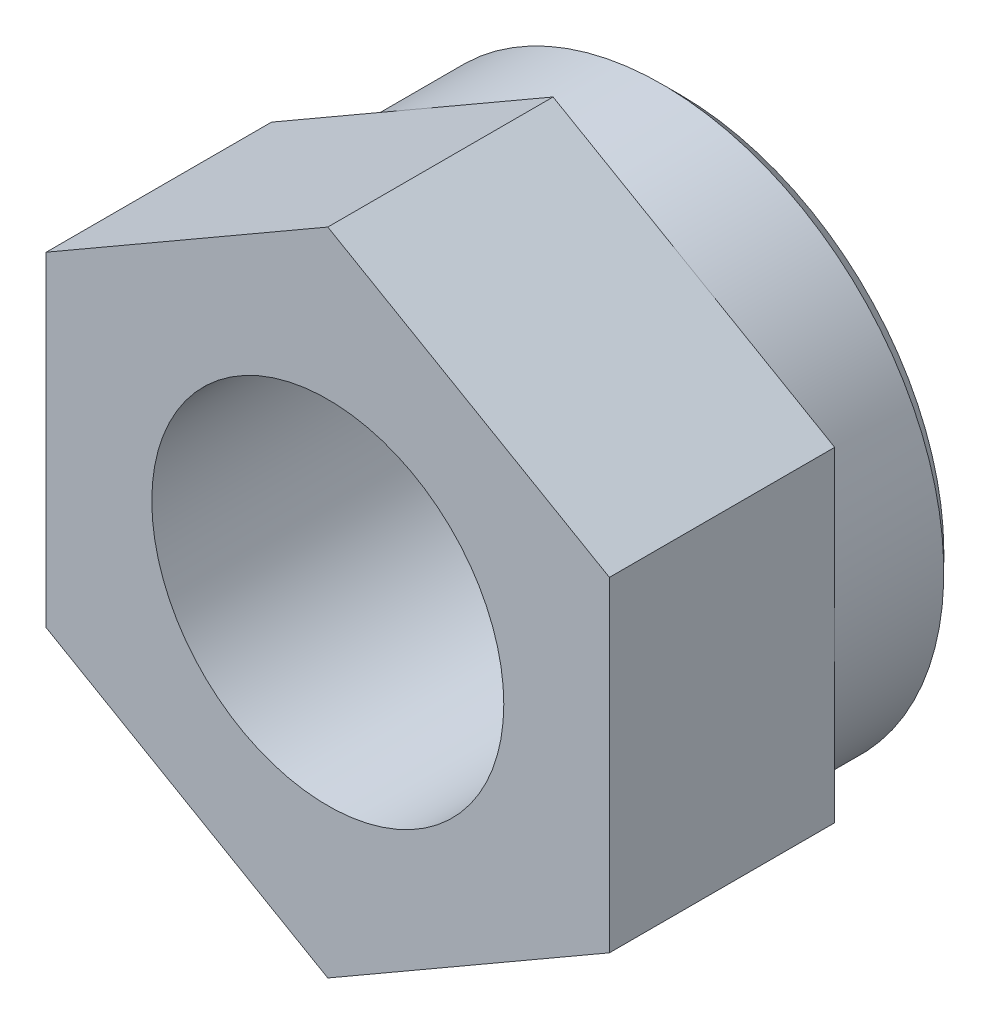
ISO-10303-21;
HEADER;
FILE_DESCRIPTION(('STEP AP214'),'2;1');
FILE_NAME('part.step','',(''),(''),'','','');
FILE_SCHEMA(('AUTOMOTIVE_DESIGN { 1 0 10303 214 1 1 1 1 }'));
ENDSEC;
DATA;
#1=APPLICATION_CONTEXT('core data for automotive mechanical design processes');
#2=APPLICATION_PROTOCOL_DEFINITION('international standard','automotive_design',2000,#1);
#3=PRODUCT_CONTEXT('',#1,'mechanical');
#4=PRODUCT('Part','Part','',(#3));
#5=PRODUCT_RELATED_PRODUCT_CATEGORY('part','',(#4));
#6=PRODUCT_DEFINITION_FORMATION('','',#4);
#7=PRODUCT_DEFINITION_CONTEXT('part definition',#1,'design');
#8=PRODUCT_DEFINITION('design','',#6,#7);
#9=PRODUCT_DEFINITION_SHAPE('','',#8);
#10=(LENGTH_UNIT() NAMED_UNIT(*) SI_UNIT(.MILLI.,.METRE.));
#11=(NAMED_UNIT(*) PLANE_ANGLE_UNIT() SI_UNIT($,.RADIAN.));
#12=(NAMED_UNIT(*) SI_UNIT($,.STERADIAN.) SOLID_ANGLE_UNIT());
#13=UNCERTAINTY_MEASURE_WITH_UNIT(LENGTH_MEASURE(1.E-05),#10,'distance_accuracy_value','');
#14=(GEOMETRIC_REPRESENTATION_CONTEXT(3) GLOBAL_UNCERTAINTY_ASSIGNED_CONTEXT((#13)) GLOBAL_UNIT_ASSIGNED_CONTEXT((#10,
#11,#12)) REPRESENTATION_CONTEXT('',''));
#15=CARTESIAN_POINT('',(0.,0.,0.));
#16=DIRECTION('',(0.,0.,1.));
#17=DIRECTION('',(1.,0.,0.));
#18=AXIS2_PLACEMENT_3D('',#15,#16,#17);
#19=CARTESIAN_POINT('',(0.,0.,0.));
#20=DIRECTION('',(0.,0.,1.));
#21=DIRECTION('',(1.,0.,0.));
#22=AXIS2_PLACEMENT_3D('',#19,#20,#21);
#23=PLANE('',#22);
#24=CARTESIAN_POINT('',(0.,0.,0.));
#25=DIRECTION('',(0.,0.,-1.));
#26=DIRECTION('',(-1.,0.,0.));
#27=AXIS2_PLACEMENT_3D('',#24,#25,#26);
#28=CIRCLE('',#27,4.);
#29=CARTESIAN_POINT('',(-4.,0.,0.));
#30=VERTEX_POINT('',#29);
#31=CARTESIAN_POINT('',(-2.,3.46410161513775,0.));
#32=VERTEX_POINT('',#31);
#33=EDGE_CURVE('E130',#30,#32,#28,.T.);
#34=ORIENTED_EDGE('',*,*,#33,.F.);
#35=DIRECTION('',(0.,-1.,0.));
#36=VECTOR('',#35,1.);
#37=CARTESIAN_POINT('',(-4.00000000000001,2.3094010767585,0.));
#38=LINE('',#37,#36);
#39=CARTESIAN_POINT('',(-4.00000000000001,2.3094010767585,0.));
#40=VERTEX_POINT('',#39);
#41=EDGE_CURVE('E113',#40,#30,#38,.T.);
#42=ORIENTED_EDGE('',*,*,#41,.F.);
#43=DIRECTION('',(-0.866025403784438,-0.500000000000001,0.));
#44=VECTOR('',#43,1.);
#45=CARTESIAN_POINT('',(0.,4.61880215351701,0.));
#46=LINE('',#45,#44);
#47=EDGE_CURVE('E131',#32,#40,#46,.T.);
#48=ORIENTED_EDGE('',*,*,#47,.F.);
#49=EDGE_LOOP('',(#34,#42,#48));
#50=FACE_BOUND('',#49,.T.);
#51=ADVANCED_FACE('F37',(#50),#23,.F.);
#52=CARTESIAN_POINT('',(1.99999999999999,3.46410161513778,0.));
#53=VERTEX_POINT('',#52);
#54=EDGE_CURVE('E53',#32,#53,#28,.T.);
#55=ORIENTED_EDGE('',*,*,#54,.F.);
#56=CARTESIAN_POINT('',(0.,4.61880215351701,0.));
#57=VERTEX_POINT('',#56);
#58=EDGE_CURVE('E128',#57,#32,#46,.T.);
#59=ORIENTED_EDGE('',*,*,#58,.F.);
#60=DIRECTION('',(-0.866025403784442,0.499999999999995,0.));
#61=VECTOR('',#60,1.);
#62=CARTESIAN_POINT('',(3.99999999999998,2.30940107675855,0.));
#63=LINE('',#62,#61);
#64=EDGE_CURVE('E147',#53,#57,#63,.T.);
#65=ORIENTED_EDGE('',*,*,#64,.F.);
#66=EDGE_LOOP('',(#55,#59,#65));
#67=FACE_BOUND('',#66,.T.);
#68=ADVANCED_FACE('F223',(#67),#23,.F.);
#69=CARTESIAN_POINT('',(4.,0.,0.));
#70=VERTEX_POINT('',#69);
#71=EDGE_CURVE('E262',#53,#70,#28,.T.);
#72=ORIENTED_EDGE('',*,*,#71,.F.);
#73=CARTESIAN_POINT('',(3.99999999999998,2.30940107675855,0.));
#74=VERTEX_POINT('',#73);
#75=EDGE_CURVE('E163',#74,#53,#63,.T.);
#76=ORIENTED_EDGE('',*,*,#75,.F.);
#77=DIRECTION('',(0.,1.,0.));
#78=VECTOR('',#77,1.);
#79=CARTESIAN_POINT('',(4.00000000000002,-2.30940107675847,0.));
#80=LINE('',#79,#78);
#81=EDGE_CURVE('E172',#70,#74,#80,.T.);
#82=ORIENTED_EDGE('',*,*,#81,.F.);
#83=EDGE_LOOP('',(#72,#76,#82));
#84=FACE_BOUND('',#83,.T.);
#85=ADVANCED_FACE('F227',(#84),#23,.F.);
#86=CARTESIAN_POINT('',(2.00000000000003,-3.46410161513774,0.));
#87=VERTEX_POINT('',#86);
#88=EDGE_CURVE('E141',#70,#87,#28,.T.);
#89=ORIENTED_EDGE('',*,*,#88,.F.);
#90=CARTESIAN_POINT('',(4.00000000000002,-2.30940107675847,0.));
#91=VERTEX_POINT('',#90);
#92=EDGE_CURVE('E152',#91,#70,#80,.T.);
#93=ORIENTED_EDGE('',*,*,#92,.F.);
#94=DIRECTION('',(0.866025403784435,0.500000000000007,0.));
#95=VECTOR('',#94,1.);
#96=CARTESIAN_POINT('',(0.,-4.61880215351701,0.));
#97=LINE('',#96,#95);
#98=EDGE_CURVE('E168',#87,#91,#97,.T.);
#99=ORIENTED_EDGE('',*,*,#98,.F.);
#100=EDGE_LOOP('',(#89,#93,#99));
#101=FACE_BOUND('',#100,.T.);
#102=ADVANCED_FACE('F220',(#101),#23,.F.);
#103=CARTESIAN_POINT('',(-1.99999999999998,-3.46410161513777,0.));
#104=VERTEX_POINT('',#103);
#105=EDGE_CURVE('E139',#87,#104,#28,.T.);
#106=ORIENTED_EDGE('',*,*,#105,.F.);
#107=CARTESIAN_POINT('',(0.,-4.61880215351701,0.));
#108=VERTEX_POINT('',#107);
#109=EDGE_CURVE('E169',#108,#87,#97,.T.);
#110=ORIENTED_EDGE('',*,*,#109,.F.);
#111=DIRECTION('',(0.866025403784442,-0.499999999999995,0.));
#112=VECTOR('',#111,1.);
#113=CARTESIAN_POINT('',(-3.99999999999999,-2.30940107675852,0.));
#114=LINE('',#113,#112);
#115=EDGE_CURVE('E123',#104,#108,#114,.T.);
#116=ORIENTED_EDGE('',*,*,#115,.F.);
#117=EDGE_LOOP('',(#106,#110,#116));
#118=FACE_BOUND('',#117,.T.);
#119=ADVANCED_FACE('F211',(#118),#23,.F.);
#120=CARTESIAN_POINT('',(0.,0.,3.2));
#121=DIRECTION('',(0.,0.,1.));
#122=DIRECTION('',(1.,0.,0.));
#123=AXIS2_PLACEMENT_3D('',#120,#121,#122);
#124=PLANE('',#123);
#125=DIRECTION('',(-0.866025403784442,0.499999999999995,0.));
#126=VECTOR('',#125,1.);
#127=CARTESIAN_POINT('',(3.99999999999998,2.30940107675855,3.2));
#128=LINE('',#127,#126);
#129=CARTESIAN_POINT('',(3.99999999999998,2.30940107675855,3.2));
#130=VERTEX_POINT('',#129);
#131=CARTESIAN_POINT('',(0.,4.61880215351701,3.2));
#132=VERTEX_POINT('',#131);
#133=EDGE_CURVE('E148',#130,#132,#128,.T.);
#134=ORIENTED_EDGE('',*,*,#133,.T.);
#135=DIRECTION('',(-0.866025403784438,-0.500000000000001,0.));
#136=VECTOR('',#135,1.);
#137=CARTESIAN_POINT('',(0.,4.61880215351701,3.2));
#138=LINE('',#137,#136);
#139=CARTESIAN_POINT('',(-4.00000000000001,2.3094010767585,3.2));
#140=VERTEX_POINT('',#139);
#141=EDGE_CURVE('E151',#132,#140,#138,.T.);
#142=ORIENTED_EDGE('',*,*,#141,.T.);
#143=DIRECTION('',(0.,-1.,0.));
#144=VECTOR('',#143,1.);
#145=CARTESIAN_POINT('',(-4.00000000000001,2.3094010767585,3.2));
#146=LINE('',#145,#144);
#147=CARTESIAN_POINT('',(-3.99999999999999,-2.30940107675852,3.2));
#148=VERTEX_POINT('',#147);
#149=EDGE_CURVE('E154',#140,#148,#146,.T.);
#150=ORIENTED_EDGE('',*,*,#149,.T.);
#151=DIRECTION('',(0.866025403784442,-0.499999999999995,0.));
#152=VECTOR('',#151,1.);
#153=CARTESIAN_POINT('',(-3.99999999999999,-2.30940107675852,3.2));
#154=LINE('',#153,#152);
#155=CARTESIAN_POINT('',(0.,-4.61880215351701,3.2));
#156=VERTEX_POINT('',#155);
#157=EDGE_CURVE('E156',#148,#156,#154,.T.);
#158=ORIENTED_EDGE('',*,*,#157,.T.);
#159=DIRECTION('',(0.866025403784435,0.500000000000007,0.));
#160=VECTOR('',#159,1.);
#161=CARTESIAN_POINT('',(0.,-4.61880215351701,3.2));
#162=LINE('',#161,#160);
#163=CARTESIAN_POINT('',(4.00000000000002,-2.30940107675847,3.2));
#164=VERTEX_POINT('',#163);
#165=EDGE_CURVE('E158',#156,#164,#162,.T.);
#166=ORIENTED_EDGE('',*,*,#165,.T.);
#167=DIRECTION('',(0.,1.,0.));
#168=VECTOR('',#167,1.);
#169=CARTESIAN_POINT('',(4.00000000000002,-2.30940107675847,3.2));
#170=LINE('',#169,#168);
#171=EDGE_CURVE('E160',#164,#130,#170,.T.);
#172=ORIENTED_EDGE('',*,*,#171,.T.);
#173=EDGE_LOOP('',(#134,#142,#150,#158,#166,#172));
#174=FACE_BOUND('',#173,.T.);
#175=CARTESIAN_POINT('',(0.,0.,3.2));
#176=DIRECTION('',(0.,0.,1.));
#177=DIRECTION('',(1.,0.,0.));
#178=AXIS2_PLACEMENT_3D('',#175,#176,#177);
#179=CIRCLE('',#178,2.5);
#180=CARTESIAN_POINT('',(2.5,0.,3.2));
#181=VERTEX_POINT('',#180);
#182=EDGE_CURVE('E134',#181,#181,#179,.T.);
#183=ORIENTED_EDGE('',*,*,#182,.F.);
#184=EDGE_LOOP('',(#183));
#185=FACE_BOUND('',#184,.T.);
#186=ADVANCED_FACE('F209',(#174,#185),#124,.T.);
#187=EDGE_CURVE('E61',#104,#30,#28,.T.);
#188=ORIENTED_EDGE('',*,*,#187,.F.);
#189=CARTESIAN_POINT('',(-3.99999999999999,-2.30940107675852,0.));
#190=VERTEX_POINT('',#189);
#191=EDGE_CURVE('E127',#190,#104,#114,.T.);
#192=ORIENTED_EDGE('',*,*,#191,.F.);
#193=EDGE_CURVE('E116',#30,#190,#38,.T.);
#194=ORIENTED_EDGE('',*,*,#193,.F.);
#195=EDGE_LOOP('',(#188,#192,#194));
#196=FACE_BOUND('',#195,.T.);
#197=ADVANCED_FACE('F125',(#196),#23,.F.);
#198=CARTESIAN_POINT('',(3.99999999999998,2.30940107675855,3.2));
#199=DIRECTION('',(-0.499999999999995,-0.866025403784442,0.));
#200=DIRECTION('',(0.866025403784442,-0.499999999999995,0.));
#201=AXIS2_PLACEMENT_3D('',#198,#199,#200);
#202=PLANE('',#201);
#203=ORIENTED_EDGE('',*,*,#75,.T.);
#204=ORIENTED_EDGE('',*,*,#64,.T.);
#205=DIRECTION('',(0.,0.,-1.));
#206=VECTOR('',#205,1.);
#207=CARTESIAN_POINT('',(0.,4.61880215351701,3.2));
#208=LINE('',#207,#206);
#209=EDGE_CURVE('E140',#132,#57,#208,.T.);
#210=ORIENTED_EDGE('',*,*,#209,.F.);
#211=ORIENTED_EDGE('',*,*,#133,.F.);
#212=DIRECTION('',(0.,0.,-1.));
#213=VECTOR('',#212,1.);
#214=CARTESIAN_POINT('',(3.99999999999998,2.30940107675855,3.2));
#215=LINE('',#214,#213);
#216=EDGE_CURVE('E162',#130,#74,#215,.T.);
#217=ORIENTED_EDGE('',*,*,#216,.T.);
#218=EDGE_LOOP('',(#203,#204,#210,#211,#217));
#219=FACE_BOUND('',#218,.T.);
#220=ADVANCED_FACE('F218',(#219),#202,.F.);
#221=CARTESIAN_POINT('',(0.,4.61880215351701,3.2));
#222=DIRECTION('',(0.500000000000001,-0.866025403784438,0.));
#223=DIRECTION('',(0.866025403784438,0.500000000000001,0.));
#224=AXIS2_PLACEMENT_3D('',#221,#222,#223);
#225=PLANE('',#224);
#226=ORIENTED_EDGE('',*,*,#58,.T.);
#227=ORIENTED_EDGE('',*,*,#47,.T.);
#228=DIRECTION('',(0.,0.,-1.));
#229=VECTOR('',#228,1.);
#230=CARTESIAN_POINT('',(-4.00000000000001,2.3094010767585,3.2));
#231=LINE('',#230,#229);
#232=EDGE_CURVE('E120',#140,#40,#231,.T.);
#233=ORIENTED_EDGE('',*,*,#232,.F.);
#234=ORIENTED_EDGE('',*,*,#141,.F.);
#235=ORIENTED_EDGE('',*,*,#209,.T.);
#236=EDGE_LOOP('',(#226,#227,#233,#234,#235));
#237=FACE_BOUND('',#236,.T.);
#238=ADVANCED_FACE('F242',(#237),#225,.F.);
#239=CARTESIAN_POINT('',(-4.00000000000001,2.3094010767585,3.2));
#240=DIRECTION('',(1.,0.,0.));
#241=DIRECTION('',(0.,1.,0.));
#242=AXIS2_PLACEMENT_3D('',#239,#240,#241);
#243=PLANE('',#242);
#244=ORIENTED_EDGE('',*,*,#41,.T.);
#245=ORIENTED_EDGE('',*,*,#193,.T.);
#246=DIRECTION('',(0.,0.,-1.));
#247=VECTOR('',#246,1.);
#248=CARTESIAN_POINT('',(-3.99999999999999,-2.30940107675852,3.2));
#249=LINE('',#248,#247);
#250=EDGE_CURVE('E183',#148,#190,#249,.T.);
#251=ORIENTED_EDGE('',*,*,#250,.F.);
#252=ORIENTED_EDGE('',*,*,#149,.F.);
#253=ORIENTED_EDGE('',*,*,#232,.T.);
#254=EDGE_LOOP('',(#244,#245,#251,#252,#253));
#255=FACE_BOUND('',#254,.T.);
#256=ADVANCED_FACE('F114',(#255),#243,.F.);
#257=CARTESIAN_POINT('',(-3.99999999999999,-2.30940107675852,3.2));
#258=DIRECTION('',(0.499999999999995,0.866025403784442,0.));
#259=DIRECTION('',(-0.866025403784442,0.499999999999995,0.));
#260=AXIS2_PLACEMENT_3D('',#257,#258,#259);
#261=PLANE('',#260);
#262=ORIENTED_EDGE('',*,*,#191,.T.);
#263=ORIENTED_EDGE('',*,*,#115,.T.);
#264=DIRECTION('',(0.,0.,-1.));
#265=VECTOR('',#264,1.);
#266=CARTESIAN_POINT('',(0.,-4.61880215351701,3.2));
#267=LINE('',#266,#265);
#268=EDGE_CURVE('E180',#156,#108,#267,.T.);
#269=ORIENTED_EDGE('',*,*,#268,.F.);
#270=ORIENTED_EDGE('',*,*,#157,.F.);
#271=ORIENTED_EDGE('',*,*,#250,.T.);
#272=EDGE_LOOP('',(#262,#263,#269,#270,#271));
#273=FACE_BOUND('',#272,.T.);
#274=ADVANCED_FACE('F235',(#273),#261,.F.);
#275=CARTESIAN_POINT('',(0.,-4.61880215351701,3.2));
#276=DIRECTION('',(-0.500000000000007,0.866025403784435,0.));
#277=DIRECTION('',(-0.866025403784435,-0.500000000000007,0.));
#278=AXIS2_PLACEMENT_3D('',#275,#276,#277);
#279=PLANE('',#278);
#280=ORIENTED_EDGE('',*,*,#109,.T.);
#281=ORIENTED_EDGE('',*,*,#98,.T.);
#282=DIRECTION('',(0.,0.,-1.));
#283=VECTOR('',#282,1.);
#284=CARTESIAN_POINT('',(4.00000000000002,-2.30940107675847,3.2));
#285=LINE('',#284,#283);
#286=EDGE_CURVE('E177',#164,#91,#285,.T.);
#287=ORIENTED_EDGE('',*,*,#286,.F.);
#288=ORIENTED_EDGE('',*,*,#165,.F.);
#289=ORIENTED_EDGE('',*,*,#268,.T.);
#290=EDGE_LOOP('',(#280,#281,#287,#288,#289));
#291=FACE_BOUND('',#290,.T.);
#292=ADVANCED_FACE('F231',(#291),#279,.F.);
#293=CARTESIAN_POINT('',(4.00000000000002,-2.30940107675847,3.2));
#294=DIRECTION('',(-1.,0.,0.));
#295=DIRECTION('',(0.,-1.,0.));
#296=AXIS2_PLACEMENT_3D('',#293,#294,#295);
#297=PLANE('',#296);
#298=ORIENTED_EDGE('',*,*,#92,.T.);
#299=ORIENTED_EDGE('',*,*,#81,.T.);
#300=ORIENTED_EDGE('',*,*,#216,.F.);
#301=ORIENTED_EDGE('',*,*,#171,.F.);
#302=ORIENTED_EDGE('',*,*,#286,.T.);
#303=EDGE_LOOP('',(#298,#299,#300,#301,#302));
#304=FACE_BOUND('',#303,.T.);
#305=ADVANCED_FACE('F205',(#304),#297,.F.);
#306=CARTESIAN_POINT('',(0.,0.,3.2));
#307=DIRECTION('',(0.,0.,-1.));
#308=DIRECTION('',(-1.,0.,0.));
#309=AXIS2_PLACEMENT_3D('',#306,#307,#308);
#310=CYLINDRICAL_SURFACE('',#309,2.5);
#311=CARTESIAN_POINT('',(0.,0.,-1.55));
#312=DIRECTION('',(0.,0.,-1.));
#313=DIRECTION('',(-1.,0.,0.));
#314=AXIS2_PLACEMENT_3D('',#311,#312,#313);
#315=CIRCLE('',#314,2.5);
#316=CARTESIAN_POINT('',(-2.5,0.,-1.55));
#317=VERTEX_POINT('',#316);
#318=EDGE_CURVE('E186',#317,#317,#315,.T.);
#319=ORIENTED_EDGE('',*,*,#318,.T.);
#320=EDGE_LOOP('',(#319));
#321=FACE_BOUND('',#320,.T.);
#322=ORIENTED_EDGE('',*,*,#182,.T.);
#323=EDGE_LOOP('',(#322));
#324=FACE_BOUND('',#323,.T.);
#325=ADVANCED_FACE('F202',(#321,#324),#310,.F.);
#326=CARTESIAN_POINT('',(0.,0.,-1.8));
#327=DIRECTION('',(0.,0.,-1.));
#328=DIRECTION('',(-1.,0.,0.));
#329=AXIS2_PLACEMENT_3D('',#326,#327,#328);
#330=PLANE('',#329);
#331=CARTESIAN_POINT('',(0.,0.,-1.8));
#332=DIRECTION('',(0.,0.,-1.));
#333=DIRECTION('',(-1.,0.,0.));
#334=AXIS2_PLACEMENT_3D('',#331,#332,#333);
#335=CIRCLE('',#334,2.75);
#336=CARTESIAN_POINT('',(-2.75,0.,-1.8));
#337=VERTEX_POINT('',#336);
#338=EDGE_CURVE('E46',#337,#337,#335,.F.);
#339=ORIENTED_EDGE('',*,*,#338,.T.);
#340=EDGE_LOOP('',(#339));
#341=FACE_BOUND('',#340,.T.);
#342=CARTESIAN_POINT('',(0.,0.,-1.8));
#343=DIRECTION('',(0.,0.,-1.));
#344=DIRECTION('',(-1.,0.,0.));
#345=AXIS2_PLACEMENT_3D('',#342,#343,#344);
#346=CIRCLE('',#345,3.75);
#347=CARTESIAN_POINT('',(-3.75,0.,-1.8));
#348=VERTEX_POINT('',#347);
#349=EDGE_CURVE('E189',#348,#348,#346,.T.);
#350=ORIENTED_EDGE('',*,*,#349,.T.);
#351=EDGE_LOOP('',(#350));
#352=FACE_BOUND('',#351,.T.);
#353=ADVANCED_FACE('F194',(#341,#352),#330,.T.);
#354=CARTESIAN_POINT('',(0.,0.,-1.8));
#355=DIRECTION('',(0.,0.,1.));
#356=DIRECTION('',(1.,0.,0.));
#357=AXIS2_PLACEMENT_3D('',#354,#355,#356);
#358=CYLINDRICAL_SURFACE('',#357,4.);
#359=CARTESIAN_POINT('',(0.,0.,-1.55));
#360=DIRECTION('',(0.,0.,-1.));
#361=DIRECTION('',(-1.,0.,0.));
#362=AXIS2_PLACEMENT_3D('',#359,#360,#361);
#363=CIRCLE('',#362,4.);
#364=CARTESIAN_POINT('',(-4.,0.,-1.55));
#365=VERTEX_POINT('',#364);
#366=EDGE_CURVE('E11',#365,#365,#363,.F.);
#367=ORIENTED_EDGE('',*,*,#366,.T.);
#368=EDGE_LOOP('',(#367));
#369=FACE_BOUND('',#368,.T.);
#370=ORIENTED_EDGE('',*,*,#33,.T.);
#371=ORIENTED_EDGE('',*,*,#54,.T.);
#372=ORIENTED_EDGE('',*,*,#71,.T.);
#373=ORIENTED_EDGE('',*,*,#88,.T.);
#374=ORIENTED_EDGE('',*,*,#105,.T.);
#375=ORIENTED_EDGE('',*,*,#187,.T.);
#376=EDGE_LOOP('',(#370,#371,#372,#373,#374,#375));
#377=FACE_BOUND('',#376,.T.);
#378=ADVANCED_FACE('F137',(#369,#377),#358,.T.);
#379=CARTESIAN_POINT('',(0.,0.,-1.55));
#380=DIRECTION('',(0.,0.,-1.));
#381=DIRECTION('',(-1.,0.,0.));
#382=AXIS2_PLACEMENT_3D('',#379,#380,#381);
#383=CONICAL_SURFACE('',#382,2.5,0.785398163397451);
#384=ORIENTED_EDGE('',*,*,#338,.F.);
#385=EDGE_LOOP('',(#384));
#386=FACE_BOUND('',#385,.T.);
#387=ORIENTED_EDGE('',*,*,#318,.F.);
#388=EDGE_LOOP('',(#387));
#389=FACE_BOUND('',#388,.T.);
#390=ADVANCED_FACE('F197',(#386,#389),#383,.F.);
#391=CARTESIAN_POINT('',(0.,0.,-1.8));
#392=DIRECTION('',(0.,0.,1.));
#393=DIRECTION('',(1.,0.,0.));
#394=AXIS2_PLACEMENT_3D('',#391,#392,#393);
#395=CONICAL_SURFACE('',#394,3.75,0.785398163397448);
#396=ORIENTED_EDGE('',*,*,#366,.F.);
#397=EDGE_LOOP('',(#396));
#398=FACE_BOUND('',#397,.T.);
#399=ORIENTED_EDGE('',*,*,#349,.F.);
#400=EDGE_LOOP('',(#399));
#401=FACE_BOUND('',#400,.T.);
#402=ADVANCED_FACE('F40',(#398,#401),#395,.T.);
#403=CLOSED_SHELL('',(#51,#68,#85,#102,#119,#186,#197,#220,#238,#256,#274,#292,#305,#325,#353,
#378,#390,#402));
#404=MANIFOLD_SOLID_BREP('B2',#403);
#405=ADVANCED_BREP_SHAPE_REPRESENTATION('',(#18,#404),#14);
#406=SHAPE_DEFINITION_REPRESENTATION(#9,#405);
ENDSEC;
END-ISO-10303-21;
